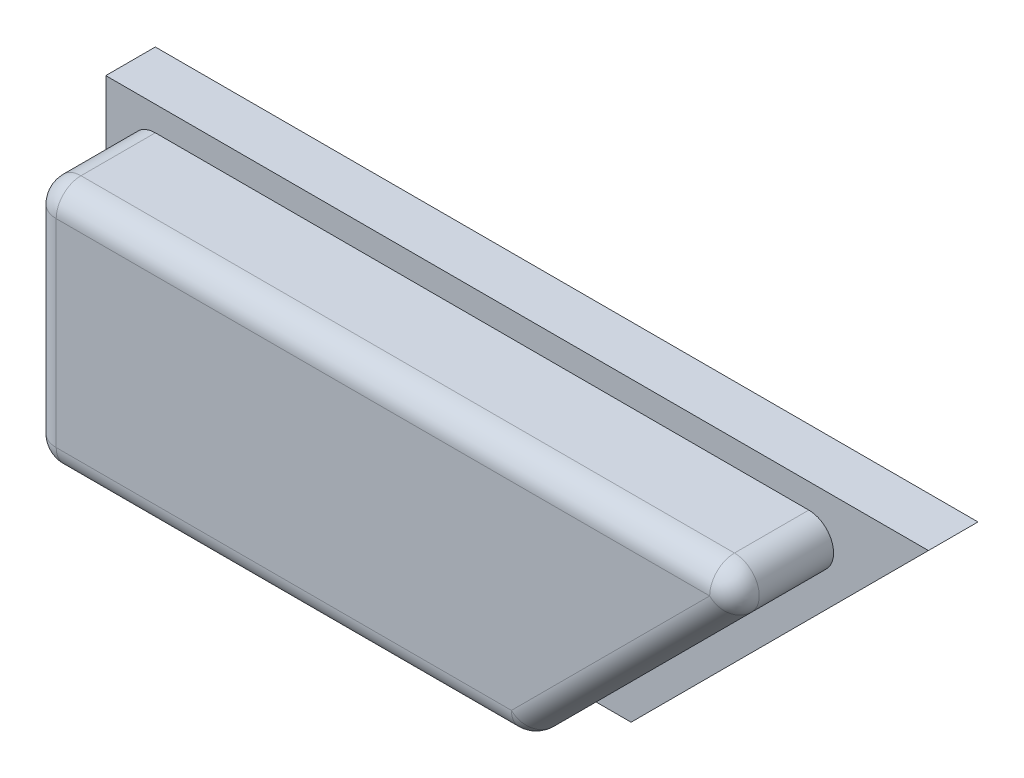
ISO-10303-21;
HEADER;
FILE_DESCRIPTION(('STEP AP214'),'2;1');
FILE_NAME('part.step','',(''),(''),'','','');
FILE_SCHEMA(('AUTOMOTIVE_DESIGN { 1 0 10303 214 1 1 1 1 }'));
ENDSEC;
DATA;
#1=APPLICATION_CONTEXT('core data for automotive mechanical design processes');
#2=APPLICATION_PROTOCOL_DEFINITION('international standard','automotive_design',2000,#1);
#3=PRODUCT_CONTEXT('',#1,'mechanical');
#4=PRODUCT('Part','Part','',(#3));
#5=PRODUCT_RELATED_PRODUCT_CATEGORY('part','',(#4));
#6=PRODUCT_DEFINITION_FORMATION('','',#4);
#7=PRODUCT_DEFINITION_CONTEXT('part definition',#1,'design');
#8=PRODUCT_DEFINITION('design','',#6,#7);
#9=PRODUCT_DEFINITION_SHAPE('','',#8);
#10=(LENGTH_UNIT() NAMED_UNIT(*) SI_UNIT(.MILLI.,.METRE.));
#11=(NAMED_UNIT(*) PLANE_ANGLE_UNIT() SI_UNIT($,.RADIAN.));
#12=(NAMED_UNIT(*) SI_UNIT($,.STERADIAN.) SOLID_ANGLE_UNIT());
#13=UNCERTAINTY_MEASURE_WITH_UNIT(LENGTH_MEASURE(1.E-05),#10,'distance_accuracy_value','');
#14=(GEOMETRIC_REPRESENTATION_CONTEXT(3) GLOBAL_UNCERTAINTY_ASSIGNED_CONTEXT((#13)) GLOBAL_UNIT_ASSIGNED_CONTEXT((#10,
#11,#12)) REPRESENTATION_CONTEXT('',''));
#15=CARTESIAN_POINT('',(0.,0.,0.));
#16=DIRECTION('',(0.,0.,1.));
#17=DIRECTION('',(1.,0.,0.));
#18=AXIS2_PLACEMENT_3D('',#15,#16,#17);
#19=CARTESIAN_POINT('',(0.,0.,1.));
#20=DIRECTION('',(0.,0.,1.));
#21=DIRECTION('',(1.,0.,0.));
#22=AXIS2_PLACEMENT_3D('',#19,#20,#21);
#23=PLANE('',#22);
#24=DIRECTION('',(0.,-1.,0.));
#25=VECTOR('',#24,1.);
#26=CARTESIAN_POINT('',(-10.4142135623731,6.99999999999999,1.));
#27=LINE('',#26,#25);
#28=CARTESIAN_POINT('',(-10.4142135623731,6.99999999999999,1.));
#29=VERTEX_POINT('',#28);
#30=CARTESIAN_POINT('',(-10.4142135623731,0.999999999999999,1.));
#31=VERTEX_POINT('',#30);
#32=EDGE_CURVE('E149',#29,#31,#27,.T.);
#33=ORIENTED_EDGE('',*,*,#32,.T.);
#34=DIRECTION('',(1.,0.,0.));
#35=VECTOR('',#34,1.);
#36=CARTESIAN_POINT('',(-10.4142135623731,0.999999999999999,1.));
#37=LINE('',#36,#35);
#38=CARTESIAN_POINT('',(0.185786437626904,0.999999999999998,1.));
#39=VERTEX_POINT('',#38);
#40=EDGE_CURVE('E138',#31,#39,#37,.T.);
#41=ORIENTED_EDGE('',*,*,#40,.T.);
#42=DIRECTION('',(0.707106781186547,0.707106781186548,0.));
#43=VECTOR('',#42,1.);
#44=CARTESIAN_POINT('',(6.18578643762689,6.99999999999999,1.));
#45=LINE('',#44,#43);
#46=CARTESIAN_POINT('',(6.18578643762689,6.99999999999999,1.));
#47=VERTEX_POINT('',#46);
#48=EDGE_CURVE('E148',#39,#47,#45,.T.);
#49=ORIENTED_EDGE('',*,*,#48,.T.);
#50=DIRECTION('',(-1.,0.,0.));
#51=VECTOR('',#50,1.);
#52=CARTESIAN_POINT('',(0.185786437626905,6.99999999999999,1.));
#53=LINE('',#52,#51);
#54=EDGE_CURVE('E154',#47,#29,#53,.T.);
#55=ORIENTED_EDGE('',*,*,#54,.T.);
#56=EDGE_LOOP('',(#33,#41,#49,#55));
#57=FACE_BOUND('',#56,.T.);
#58=DIRECTION('',(1.,0.,0.));
#59=VECTOR('',#58,1.);
#60=CARTESIAN_POINT('',(-9.91421356237309,1.5,1.));
#61=LINE('',#60,#59);
#62=CARTESIAN_POINT('',(-9.41421356237309,1.5,1.));
#63=VERTEX_POINT('',#62);
#64=CARTESIAN_POINT('',(-0.228427124746192,1.5,1.));
#65=VERTEX_POINT('',#64);
#66=EDGE_CURVE('E243',#63,#65,#61,.T.);
#67=ORIENTED_EDGE('',*,*,#66,.F.);
#68=CARTESIAN_POINT('',(-9.41421356237309,2.,1.));
#69=DIRECTION('',(0.,0.,1.));
#70=DIRECTION('',(1.,0.,0.));
#71=AXIS2_PLACEMENT_3D('',#68,#69,#70);
#72=CIRCLE('',#71,0.5);
#73=CARTESIAN_POINT('',(-9.91421356237309,2.,1.));
#74=VERTEX_POINT('',#73);
#75=EDGE_CURVE('E190',#63,#74,#72,.F.);
#76=ORIENTED_EDGE('',*,*,#75,.T.);
#77=DIRECTION('',(0.,-1.,0.));
#78=VECTOR('',#77,1.);
#79=CARTESIAN_POINT('',(-9.91421356237309,6.5,1.));
#80=LINE('',#79,#78);
#81=CARTESIAN_POINT('',(-9.91421356237309,6.,1.));
#82=VERTEX_POINT('',#81);
#83=EDGE_CURVE('E238',#82,#74,#80,.T.);
#84=ORIENTED_EDGE('',*,*,#83,.F.);
#85=CARTESIAN_POINT('',(-9.41421356237309,6.,1.));
#86=DIRECTION('',(0.,0.,1.));
#87=DIRECTION('',(1.,0.,0.));
#88=AXIS2_PLACEMENT_3D('',#85,#86,#87);
#89=CIRCLE('',#88,0.5);
#90=CARTESIAN_POINT('',(-9.41421356237309,6.5,1.));
#91=VERTEX_POINT('',#90);
#92=EDGE_CURVE('E188',#82,#91,#89,.F.);
#93=ORIENTED_EDGE('',*,*,#92,.T.);
#94=DIRECTION('',(-1.,0.,0.));
#95=VECTOR('',#94,1.);
#96=CARTESIAN_POINT('',(-9.91421356237309,6.5,1.));
#97=LINE('',#96,#95);
#98=CARTESIAN_POINT('',(3.77157287525381,6.5,1.));
#99=VERTEX_POINT('',#98);
#100=EDGE_CURVE('E253',#99,#91,#97,.T.);
#101=ORIENTED_EDGE('',*,*,#100,.F.);
#102=CARTESIAN_POINT('',(3.77157287525381,6.,1.));
#103=DIRECTION('',(0.,0.,1.));
#104=DIRECTION('',(1.,0.,0.));
#105=AXIS2_PLACEMENT_3D('',#102,#103,#104);
#106=CIRCLE('',#105,0.5);
#107=CARTESIAN_POINT('',(4.12512626584708,5.64644660940672,1.));
#108=VERTEX_POINT('',#107);
#109=EDGE_CURVE('E186',#99,#108,#106,.F.);
#110=ORIENTED_EDGE('',*,*,#109,.T.);
#111=DIRECTION('',(0.707106781186548,0.707106781186548,0.));
#112=VECTOR('',#111,1.);
#113=CARTESIAN_POINT('',(4.97867965644035,6.49999999999999,1.));
#114=LINE('',#113,#112);
#115=CARTESIAN_POINT('',(0.125126265847081,1.64644660940672,1.));
#116=VERTEX_POINT('',#115);
#117=EDGE_CURVE('E248',#116,#108,#114,.T.);
#118=ORIENTED_EDGE('',*,*,#117,.F.);
#119=CARTESIAN_POINT('',(-0.228427124746191,2.,1.));
#120=DIRECTION('',(0.,0.,1.));
#121=DIRECTION('',(1.,0.,0.));
#122=AXIS2_PLACEMENT_3D('',#119,#120,#121);
#123=CIRCLE('',#122,0.5);
#124=EDGE_CURVE('E192',#116,#65,#123,.F.);
#125=ORIENTED_EDGE('',*,*,#124,.T.);
#126=EDGE_LOOP('',(#67,#76,#84,#93,#101,#110,#118,#125));
#127=FACE_BOUND('',#126,.T.);
#128=ADVANCED_FACE('F35',(#57,#127),#23,.T.);
#129=CARTESIAN_POINT('',(-10.4142135623731,6.99999999999999,1.));
#130=DIRECTION('',(1.,0.,0.));
#131=DIRECTION('',(0.,1.,0.));
#132=AXIS2_PLACEMENT_3D('',#129,#130,#131);
#133=PLANE('',#132);
#134=DIRECTION('',(0.,-1.,0.));
#135=VECTOR('',#134,1.);
#136=CARTESIAN_POINT('',(-10.4142135623731,6.99999999999999,0.));
#137=LINE('',#136,#135);
#138=CARTESIAN_POINT('',(-10.4142135623731,6.99999999999999,0.));
#139=VERTEX_POINT('',#138);
#140=CARTESIAN_POINT('',(-10.4142135623731,0.999999999999999,0.));
#141=VERTEX_POINT('',#140);
#142=EDGE_CURVE('E162',#139,#141,#137,.T.);
#143=ORIENTED_EDGE('',*,*,#142,.T.);
#144=DIRECTION('',(0.,0.,-1.));
#145=VECTOR('',#144,1.);
#146=CARTESIAN_POINT('',(-10.4142135623731,0.999999999999999,1.));
#147=LINE('',#146,#145);
#148=EDGE_CURVE('E142',#31,#141,#147,.T.);
#149=ORIENTED_EDGE('',*,*,#148,.F.);
#150=ORIENTED_EDGE('',*,*,#32,.F.);
#151=DIRECTION('',(0.,0.,-1.));
#152=VECTOR('',#151,1.);
#153=CARTESIAN_POINT('',(-10.4142135623731,6.99999999999999,1.));
#154=LINE('',#153,#152);
#155=EDGE_CURVE('E258',#29,#139,#154,.T.);
#156=ORIENTED_EDGE('',*,*,#155,.T.);
#157=EDGE_LOOP('',(#143,#149,#150,#156));
#158=FACE_BOUND('',#157,.T.);
#159=ADVANCED_FACE('F160',(#158),#133,.F.);
#160=CARTESIAN_POINT('',(-10.4142135623731,0.999999999999999,1.));
#161=DIRECTION('',(0.,1.,0.));
#162=DIRECTION('',(-1.,0.,0.));
#163=AXIS2_PLACEMENT_3D('',#160,#161,#162);
#164=PLANE('',#163);
#165=DIRECTION('',(1.,0.,0.));
#166=VECTOR('',#165,1.);
#167=CARTESIAN_POINT('',(-10.4142135623731,0.999999999999999,0.));
#168=LINE('',#167,#166);
#169=CARTESIAN_POINT('',(0.185786437626904,0.999999999999998,0.));
#170=VERTEX_POINT('',#169);
#171=EDGE_CURVE('E260',#141,#170,#168,.T.);
#172=ORIENTED_EDGE('',*,*,#171,.T.);
#173=DIRECTION('',(0.,0.,-1.));
#174=VECTOR('',#173,1.);
#175=CARTESIAN_POINT('',(0.185786437626904,0.999999999999998,1.));
#176=LINE('',#175,#174);
#177=EDGE_CURVE('E145',#39,#170,#176,.T.);
#178=ORIENTED_EDGE('',*,*,#177,.F.);
#179=ORIENTED_EDGE('',*,*,#40,.F.);
#180=ORIENTED_EDGE('',*,*,#148,.T.);
#181=EDGE_LOOP('',(#172,#178,#179,#180));
#182=FACE_BOUND('',#181,.T.);
#183=ADVANCED_FACE('F140',(#182),#164,.F.);
#184=CARTESIAN_POINT('',(6.18578643762689,6.99999999999999,1.));
#185=DIRECTION('',(-0.707106781186548,0.707106781186547,0.));
#186=DIRECTION('',(-0.707106781186547,-0.707106781186548,0.));
#187=AXIS2_PLACEMENT_3D('',#184,#185,#186);
#188=PLANE('',#187);
#189=DIRECTION('',(0.707106781186547,0.707106781186548,0.));
#190=VECTOR('',#189,1.);
#191=CARTESIAN_POINT('',(6.18578643762689,6.99999999999999,0.));
#192=LINE('',#191,#190);
#193=CARTESIAN_POINT('',(6.18578643762689,6.99999999999999,0.));
#194=VERTEX_POINT('',#193);
#195=EDGE_CURVE('E262',#170,#194,#192,.T.);
#196=ORIENTED_EDGE('',*,*,#195,.T.);
#197=DIRECTION('',(0.,0.,-1.));
#198=VECTOR('',#197,1.);
#199=CARTESIAN_POINT('',(6.18578643762689,6.99999999999999,1.));
#200=LINE('',#199,#198);
#201=EDGE_CURVE('E167',#47,#194,#200,.T.);
#202=ORIENTED_EDGE('',*,*,#201,.F.);
#203=ORIENTED_EDGE('',*,*,#48,.F.);
#204=ORIENTED_EDGE('',*,*,#177,.T.);
#205=EDGE_LOOP('',(#196,#202,#203,#204));
#206=FACE_BOUND('',#205,.T.);
#207=ADVANCED_FACE('F271',(#206),#188,.F.);
#208=CARTESIAN_POINT('',(-10.4142135623731,6.99999999999999,1.));
#209=DIRECTION('',(0.,-1.,0.));
#210=DIRECTION('',(0.,0.,-1.));
#211=AXIS2_PLACEMENT_3D('',#208,#209,#210);
#212=PLANE('',#211);
#213=DIRECTION('',(-1.,0.,0.));
#214=VECTOR('',#213,1.);
#215=CARTESIAN_POINT('',(-10.4142135623731,6.99999999999999,0.));
#216=LINE('',#215,#214);
#217=EDGE_CURVE('E158',#194,#139,#216,.T.);
#218=ORIENTED_EDGE('',*,*,#217,.T.);
#219=ORIENTED_EDGE('',*,*,#155,.F.);
#220=ORIENTED_EDGE('',*,*,#54,.F.);
#221=ORIENTED_EDGE('',*,*,#201,.T.);
#222=EDGE_LOOP('',(#218,#219,#220,#221));
#223=FACE_BOUND('',#222,.T.);
#224=ADVANCED_FACE('F269',(#223),#212,.F.);
#225=CARTESIAN_POINT('',(0.,0.,0.));
#226=DIRECTION('',(0.,0.,1.));
#227=DIRECTION('',(1.,0.,0.));
#228=AXIS2_PLACEMENT_3D('',#225,#226,#227);
#229=PLANE('',#228);
#230=ORIENTED_EDGE('',*,*,#142,.F.);
#231=ORIENTED_EDGE('',*,*,#217,.F.);
#232=ORIENTED_EDGE('',*,*,#195,.F.);
#233=ORIENTED_EDGE('',*,*,#171,.F.);
#234=EDGE_LOOP('',(#230,#231,#232,#233));
#235=FACE_BOUND('',#234,.T.);
#236=ADVANCED_FACE('F274',(#235),#229,.F.);
#237=CARTESIAN_POINT('',(-9.91421356237309,6.5,3.));
#238=DIRECTION('',(1.,0.,0.));
#239=DIRECTION('',(0.,0.,-1.));
#240=AXIS2_PLACEMENT_3D('',#237,#238,#239);
#241=PLANE('',#240);
#242=DIRECTION('',(0.,0.,-1.));
#243=VECTOR('',#242,1.);
#244=CARTESIAN_POINT('',(-9.91421356237309,2.,3.));
#245=LINE('',#244,#243);
#246=CARTESIAN_POINT('',(-9.91421356237309,2.,2.5));
#247=VERTEX_POINT('',#246);
#248=EDGE_CURVE('E177',#74,#247,#245,.F.);
#249=ORIENTED_EDGE('',*,*,#248,.T.);
#250=DIRECTION('',(0.,-1.,0.));
#251=VECTOR('',#250,1.);
#252=CARTESIAN_POINT('',(-9.91421356237309,6.,2.5));
#253=LINE('',#252,#251);
#254=CARTESIAN_POINT('',(-9.91421356237309,6.,2.5));
#255=VERTEX_POINT('',#254);
#256=EDGE_CURVE('E44',#247,#255,#253,.F.);
#257=ORIENTED_EDGE('',*,*,#256,.T.);
#258=DIRECTION('',(0.,0.,-1.));
#259=VECTOR('',#258,1.);
#260=CARTESIAN_POINT('',(-9.91421356237309,6.,3.));
#261=LINE('',#260,#259);
#262=EDGE_CURVE('E179',#255,#82,#261,.T.);
#263=ORIENTED_EDGE('',*,*,#262,.T.);
#264=ORIENTED_EDGE('',*,*,#83,.T.);
#265=EDGE_LOOP('',(#249,#257,#263,#264));
#266=FACE_BOUND('',#265,.T.);
#267=ADVANCED_FACE('F276',(#266),#241,.F.);
#268=CARTESIAN_POINT('',(-9.91421356237309,1.5,3.));
#269=DIRECTION('',(0.,1.,0.));
#270=DIRECTION('',(0.,0.,1.));
#271=AXIS2_PLACEMENT_3D('',#268,#269,#270);
#272=PLANE('',#271);
#273=DIRECTION('',(0.,0.,-1.));
#274=VECTOR('',#273,1.);
#275=CARTESIAN_POINT('',(-0.228427124746192,1.5,3.));
#276=LINE('',#275,#274);
#277=CARTESIAN_POINT('',(-0.228427124746192,1.5,2.5));
#278=VERTEX_POINT('',#277);
#279=EDGE_CURVE('E181',#65,#278,#276,.F.);
#280=ORIENTED_EDGE('',*,*,#279,.T.);
#281=DIRECTION('',(1.,0.,0.));
#282=VECTOR('',#281,1.);
#283=CARTESIAN_POINT('',(-9.41421356237309,1.5,2.5));
#284=LINE('',#283,#282);
#285=CARTESIAN_POINT('',(-9.41421356237309,1.5,2.5));
#286=VERTEX_POINT('',#285);
#287=EDGE_CURVE('E210',#278,#286,#284,.F.);
#288=ORIENTED_EDGE('',*,*,#287,.T.);
#289=DIRECTION('',(0.,0.,-1.));
#290=VECTOR('',#289,1.);
#291=CARTESIAN_POINT('',(-9.41421356237309,1.5,3.));
#292=LINE('',#291,#290);
#293=EDGE_CURVE('E184',#286,#63,#292,.T.);
#294=ORIENTED_EDGE('',*,*,#293,.T.);
#295=ORIENTED_EDGE('',*,*,#66,.T.);
#296=EDGE_LOOP('',(#280,#288,#294,#295));
#297=FACE_BOUND('',#296,.T.);
#298=ADVANCED_FACE('F283',(#297),#272,.F.);
#299=CARTESIAN_POINT('',(4.97867965644035,6.49999999999999,3.));
#300=DIRECTION('',(-0.707106781186547,0.707106781186548,0.));
#301=DIRECTION('',(-0.707106781186548,-0.707106781186547,0.));
#302=AXIS2_PLACEMENT_3D('',#299,#300,#301);
#303=PLANE('',#302);
#304=DIRECTION('',(0.,0.,-1.));
#305=VECTOR('',#304,1.);
#306=CARTESIAN_POINT('',(4.12512626584708,5.64644660940672,3.));
#307=LINE('',#306,#305);
#308=CARTESIAN_POINT('',(4.12512626584708,5.64644660940672,2.5));
#309=VERTEX_POINT('',#308);
#310=EDGE_CURVE('E174',#108,#309,#307,.F.);
#311=ORIENTED_EDGE('',*,*,#310,.T.);
#312=DIRECTION('',(0.707106781186548,0.707106781186547,0.));
#313=VECTOR('',#312,1.);
#314=CARTESIAN_POINT('',(0.125126265847081,1.64644660940672,2.5));
#315=LINE('',#314,#313);
#316=CARTESIAN_POINT('',(0.125126265847082,1.64644660940672,2.5));
#317=VERTEX_POINT('',#316);
#318=EDGE_CURVE('E206',#309,#317,#315,.F.);
#319=ORIENTED_EDGE('',*,*,#318,.T.);
#320=DIRECTION('',(0.,0.,-1.));
#321=VECTOR('',#320,1.);
#322=CARTESIAN_POINT('',(0.125126265847082,1.64644660940672,3.));
#323=LINE('',#322,#321);
#324=EDGE_CURVE('E172',#317,#116,#323,.T.);
#325=ORIENTED_EDGE('',*,*,#324,.T.);
#326=ORIENTED_EDGE('',*,*,#117,.T.);
#327=EDGE_LOOP('',(#311,#319,#325,#326));
#328=FACE_BOUND('',#327,.T.);
#329=ADVANCED_FACE('F295',(#328),#303,.F.);
#330=CARTESIAN_POINT('',(-9.91421356237309,6.5,3.));
#331=DIRECTION('',(0.,-1.,0.));
#332=DIRECTION('',(0.,0.,-1.));
#333=AXIS2_PLACEMENT_3D('',#330,#331,#332);
#334=PLANE('',#333);
#335=DIRECTION('',(0.,0.,-1.));
#336=VECTOR('',#335,1.);
#337=CARTESIAN_POINT('',(-9.41421356237309,6.5,3.));
#338=LINE('',#337,#336);
#339=CARTESIAN_POINT('',(-9.41421356237309,6.5,2.5));
#340=VERTEX_POINT('',#339);
#341=EDGE_CURVE('E163',#91,#340,#338,.F.);
#342=ORIENTED_EDGE('',*,*,#341,.T.);
#343=DIRECTION('',(-1.,0.,0.));
#344=VECTOR('',#343,1.);
#345=CARTESIAN_POINT('',(3.77157287525381,6.5,2.5));
#346=LINE('',#345,#344);
#347=CARTESIAN_POINT('',(3.77157287525381,6.5,2.5));
#348=VERTEX_POINT('',#347);
#349=EDGE_CURVE('E11',#340,#348,#346,.F.);
#350=ORIENTED_EDGE('',*,*,#349,.T.);
#351=DIRECTION('',(0.,0.,-1.));
#352=VECTOR('',#351,1.);
#353=CARTESIAN_POINT('',(3.77157287525381,6.5,3.));
#354=LINE('',#353,#352);
#355=EDGE_CURVE('E165',#348,#99,#354,.T.);
#356=ORIENTED_EDGE('',*,*,#355,.T.);
#357=ORIENTED_EDGE('',*,*,#100,.T.);
#358=EDGE_LOOP('',(#342,#350,#356,#357));
#359=FACE_BOUND('',#358,.T.);
#360=ADVANCED_FACE('F299',(#359),#334,.F.);
#361=CARTESIAN_POINT('',(0.,0.,3.));
#362=DIRECTION('',(0.,0.,1.));
#363=DIRECTION('',(1.,0.,0.));
#364=AXIS2_PLACEMENT_3D('',#361,#362,#363);
#365=PLANE('',#364);
#366=DIRECTION('',(1.,0.,0.));
#367=VECTOR('',#366,1.);
#368=CARTESIAN_POINT('',(-0.228427124746192,2.,3.));
#369=LINE('',#368,#367);
#370=CARTESIAN_POINT('',(-9.41421356237309,2.,3.));
#371=VERTEX_POINT('',#370);
#372=CARTESIAN_POINT('',(-0.228427124746191,2.,3.));
#373=VERTEX_POINT('',#372);
#374=EDGE_CURVE('E201',#371,#373,#369,.T.);
#375=ORIENTED_EDGE('',*,*,#374,.T.);
#376=DIRECTION('',(0.707106781186548,0.707106781186547,0.));
#377=VECTOR('',#376,1.);
#378=CARTESIAN_POINT('',(3.77157287525381,6.,3.));
#379=LINE('',#378,#377);
#380=CARTESIAN_POINT('',(3.77157287525381,6.,3.));
#381=VERTEX_POINT('',#380);
#382=EDGE_CURVE('E203',#373,#381,#379,.T.);
#383=ORIENTED_EDGE('',*,*,#382,.T.);
#384=DIRECTION('',(-1.,0.,0.));
#385=VECTOR('',#384,1.);
#386=CARTESIAN_POINT('',(-9.41421356237309,6.,3.));
#387=LINE('',#386,#385);
#388=CARTESIAN_POINT('',(-9.41421356237309,6.,3.));
#389=VERTEX_POINT('',#388);
#390=EDGE_CURVE('E197',#381,#389,#387,.T.);
#391=ORIENTED_EDGE('',*,*,#390,.T.);
#392=DIRECTION('',(0.,-1.,0.));
#393=VECTOR('',#392,1.);
#394=CARTESIAN_POINT('',(-9.41421356237309,2.,3.));
#395=LINE('',#394,#393);
#396=EDGE_CURVE('E199',#389,#371,#395,.T.);
#397=ORIENTED_EDGE('',*,*,#396,.T.);
#398=EDGE_LOOP('',(#375,#383,#391,#397));
#399=FACE_BOUND('',#398,.T.);
#400=ADVANCED_FACE('F303',(#399),#365,.T.);
#401=CARTESIAN_POINT('',(3.77157287525381,6.,3.));
#402=DIRECTION('',(0.,0.,-1.));
#403=DIRECTION('',(-1.,0.,0.));
#404=AXIS2_PLACEMENT_3D('',#401,#402,#403);
#405=CYLINDRICAL_SURFACE('',#404,0.5);
#406=ORIENTED_EDGE('',*,*,#355,.F.);
#407=CARTESIAN_POINT('',(3.77157287525381,6.,2.5));
#408=DIRECTION('',(0.,0.,-1.));
#409=DIRECTION('',(-1.,0.,0.));
#410=AXIS2_PLACEMENT_3D('',#407,#408,#409);
#411=CIRCLE('',#410,0.5);
#412=EDGE_CURVE('E194',#348,#309,#411,.T.);
#413=ORIENTED_EDGE('',*,*,#412,.T.);
#414=ORIENTED_EDGE('',*,*,#310,.F.);
#415=ORIENTED_EDGE('',*,*,#109,.F.);
#416=EDGE_LOOP('',(#406,#413,#414,#415));
#417=FACE_BOUND('',#416,.T.);
#418=ADVANCED_FACE('F306',(#417),#405,.T.);
#419=CARTESIAN_POINT('',(-9.41421356237309,6.,3.));
#420=DIRECTION('',(0.,0.,-1.));
#421=DIRECTION('',(-1.,0.,0.));
#422=AXIS2_PLACEMENT_3D('',#419,#420,#421);
#423=CYLINDRICAL_SURFACE('',#422,0.5);
#424=ORIENTED_EDGE('',*,*,#262,.F.);
#425=CARTESIAN_POINT('',(-9.41421356237309,6.,2.5));
#426=DIRECTION('',(0.,0.,-1.));
#427=DIRECTION('',(-1.,0.,0.));
#428=AXIS2_PLACEMENT_3D('',#425,#426,#427);
#429=CIRCLE('',#428,0.5);
#430=EDGE_CURVE('E58',#255,#340,#429,.T.);
#431=ORIENTED_EDGE('',*,*,#430,.T.);
#432=ORIENTED_EDGE('',*,*,#341,.F.);
#433=ORIENTED_EDGE('',*,*,#92,.F.);
#434=EDGE_LOOP('',(#424,#431,#432,#433));
#435=FACE_BOUND('',#434,.T.);
#436=ADVANCED_FACE('F311',(#435),#423,.T.);
#437=CARTESIAN_POINT('',(-9.41421356237309,2.,3.));
#438=DIRECTION('',(0.,0.,-1.));
#439=DIRECTION('',(-1.,0.,0.));
#440=AXIS2_PLACEMENT_3D('',#437,#438,#439);
#441=CYLINDRICAL_SURFACE('',#440,0.5);
#442=ORIENTED_EDGE('',*,*,#293,.F.);
#443=CARTESIAN_POINT('',(-9.41421356237309,2.,2.5));
#444=DIRECTION('',(0.,0.,-1.));
#445=DIRECTION('',(-1.,0.,0.));
#446=AXIS2_PLACEMENT_3D('',#443,#444,#445);
#447=CIRCLE('',#446,0.5);
#448=EDGE_CURVE('E212',#286,#247,#447,.T.);
#449=ORIENTED_EDGE('',*,*,#448,.T.);
#450=ORIENTED_EDGE('',*,*,#248,.F.);
#451=ORIENTED_EDGE('',*,*,#75,.F.);
#452=EDGE_LOOP('',(#442,#449,#450,#451));
#453=FACE_BOUND('',#452,.T.);
#454=ADVANCED_FACE('F368',(#453),#441,.T.);
#455=CARTESIAN_POINT('',(-0.228427124746191,2.,3.));
#456=DIRECTION('',(0.,0.,-1.));
#457=DIRECTION('',(-1.,0.,0.));
#458=AXIS2_PLACEMENT_3D('',#455,#456,#457);
#459=CYLINDRICAL_SURFACE('',#458,0.5);
#460=ORIENTED_EDGE('',*,*,#324,.F.);
#461=CARTESIAN_POINT('',(-0.228427124746191,2.,2.5));
#462=DIRECTION('',(0.,0.,-1.));
#463=DIRECTION('',(-1.,0.,0.));
#464=AXIS2_PLACEMENT_3D('',#461,#462,#463);
#465=CIRCLE('',#464,0.5);
#466=EDGE_CURVE('E208',#317,#278,#465,.T.);
#467=ORIENTED_EDGE('',*,*,#466,.T.);
#468=ORIENTED_EDGE('',*,*,#279,.F.);
#469=ORIENTED_EDGE('',*,*,#124,.F.);
#470=EDGE_LOOP('',(#460,#467,#468,#469));
#471=FACE_BOUND('',#470,.T.);
#472=ADVANCED_FACE('F349',(#471),#459,.T.);
#473=CARTESIAN_POINT('',(-9.41421356237309,2.,2.5));
#474=DIRECTION('',(0.,0.,1.));
#475=DIRECTION('',(1.,0.,0.));
#476=AXIS2_PLACEMENT_3D('',#473,#474,#475);
#477=SPHERICAL_SURFACE('',#476,0.5);
#478=CARTESIAN_POINT('',(-9.41421356237309,2.,2.5));
#479=DIRECTION('',(0.,1.,0.));
#480=DIRECTION('',(-1.,0.,0.));
#481=AXIS2_PLACEMENT_3D('',#478,#479,#480);
#482=CIRCLE('',#481,0.5);
#483=EDGE_CURVE('E231',#247,#371,#482,.T.);
#484=ORIENTED_EDGE('',*,*,#483,.F.);
#485=ORIENTED_EDGE('',*,*,#448,.F.);
#486=CARTESIAN_POINT('',(-9.41421356237309,2.,2.5));
#487=DIRECTION('',(1.,0.,0.));
#488=DIRECTION('',(0.,0.,-1.));
#489=AXIS2_PLACEMENT_3D('',#486,#487,#488);
#490=CIRCLE('',#489,0.5);
#491=EDGE_CURVE('E39',#371,#286,#490,.T.);
#492=ORIENTED_EDGE('',*,*,#491,.F.);
#493=EDGE_LOOP('',(#484,#485,#492));
#494=FACE_BOUND('',#493,.T.);
#495=ADVANCED_FACE('F37',(#494),#477,.T.);
#496=CARTESIAN_POINT('',(0.,2.,2.5));
#497=DIRECTION('',(-1.,0.,0.));
#498=DIRECTION('',(0.,0.,1.));
#499=AXIS2_PLACEMENT_3D('',#496,#497,#498);
#500=CYLINDRICAL_SURFACE('',#499,0.5);
#501=ORIENTED_EDGE('',*,*,#491,.T.);
#502=ORIENTED_EDGE('',*,*,#287,.F.);
#503=CARTESIAN_POINT('',(-0.228427124746191,2.,2.5));
#504=DIRECTION('',(1.,0.,0.));
#505=DIRECTION('',(0.,1.,0.));
#506=AXIS2_PLACEMENT_3D('',#503,#504,#505);
#507=CIRCLE('',#506,0.5);
#508=EDGE_CURVE('E229',#373,#278,#507,.T.);
#509=ORIENTED_EDGE('',*,*,#508,.F.);
#510=ORIENTED_EDGE('',*,*,#374,.F.);
#511=EDGE_LOOP('',(#501,#502,#509,#510));
#512=FACE_BOUND('',#511,.T.);
#513=ADVANCED_FACE('F317',(#512),#500,.T.);
#514=CARTESIAN_POINT('',(-9.41421356237309,0.,2.5));
#515=DIRECTION('',(0.,1.,0.));
#516=DIRECTION('',(0.,0.,1.));
#517=AXIS2_PLACEMENT_3D('',#514,#515,#516);
#518=CYLINDRICAL_SURFACE('',#517,0.5);
#519=ORIENTED_EDGE('',*,*,#483,.T.);
#520=ORIENTED_EDGE('',*,*,#396,.F.);
#521=CARTESIAN_POINT('',(-9.41421356237309,6.,2.5));
#522=DIRECTION('',(0.,1.,0.));
#523=DIRECTION('',(0.,0.,1.));
#524=AXIS2_PLACEMENT_3D('',#521,#522,#523);
#525=CIRCLE('',#524,0.5);
#526=EDGE_CURVE('E226',#255,#389,#525,.T.);
#527=ORIENTED_EDGE('',*,*,#526,.F.);
#528=ORIENTED_EDGE('',*,*,#256,.F.);
#529=EDGE_LOOP('',(#519,#520,#527,#528));
#530=FACE_BOUND('',#529,.T.);
#531=ADVANCED_FACE('F334',(#530),#518,.T.);
#532=CARTESIAN_POINT('',(-0.228427124746191,2.,2.5));
#533=DIRECTION('',(0.,0.,1.));
#534=DIRECTION('',(1.,0.,0.));
#535=AXIS2_PLACEMENT_3D('',#532,#533,#534);
#536=SPHERICAL_SURFACE('',#535,0.5);
#537=ORIENTED_EDGE('',*,*,#508,.T.);
#538=ORIENTED_EDGE('',*,*,#466,.F.);
#539=CARTESIAN_POINT('',(-0.228427124746191,2.,2.5));
#540=DIRECTION('',(0.707106781186548,0.707106781186547,0.));
#541=DIRECTION('',(-0.707106781186547,0.707106781186548,0.));
#542=AXIS2_PLACEMENT_3D('',#539,#540,#541);
#543=CIRCLE('',#542,0.5);
#544=EDGE_CURVE('E223',#373,#317,#543,.T.);
#545=ORIENTED_EDGE('',*,*,#544,.F.);
#546=EDGE_LOOP('',(#537,#538,#545));
#547=FACE_BOUND('',#546,.T.);
#548=ADVANCED_FACE('F320',(#547),#536,.T.);
#549=CARTESIAN_POINT('',(-9.41421356237309,6.,2.5));
#550=DIRECTION('',(0.,0.,1.));
#551=DIRECTION('',(1.,0.,0.));
#552=AXIS2_PLACEMENT_3D('',#549,#550,#551);
#553=SPHERICAL_SURFACE('',#552,0.5);
#554=ORIENTED_EDGE('',*,*,#430,.F.);
#555=ORIENTED_EDGE('',*,*,#526,.T.);
#556=CARTESIAN_POINT('',(-9.41421356237309,6.,2.5));
#557=DIRECTION('',(1.,0.,0.));
#558=DIRECTION('',(0.,0.,-1.));
#559=AXIS2_PLACEMENT_3D('',#556,#557,#558);
#560=CIRCLE('',#559,0.5);
#561=EDGE_CURVE('E220',#340,#389,#560,.T.);
#562=ORIENTED_EDGE('',*,*,#561,.F.);
#563=EDGE_LOOP('',(#554,#555,#562));
#564=FACE_BOUND('',#563,.T.);
#565=ADVANCED_FACE('F336',(#564),#553,.T.);
#566=CARTESIAN_POINT('',(-1.11421356237309,1.1142135623731,2.5));
#567=DIRECTION('',(-0.707106781186548,-0.707106781186547,0.));
#568=DIRECTION('',(0.707106781186547,-0.707106781186548,0.));
#569=AXIS2_PLACEMENT_3D('',#566,#567,#568);
#570=CYLINDRICAL_SURFACE('',#569,0.5);
#571=ORIENTED_EDGE('',*,*,#544,.T.);
#572=ORIENTED_EDGE('',*,*,#318,.F.);
#573=CARTESIAN_POINT('',(3.77157287525381,6.,2.5));
#574=DIRECTION('',(0.707106781186547,0.707106781186547,0.));
#575=DIRECTION('',(-0.707106781186548,0.707106781186548,0.));
#576=AXIS2_PLACEMENT_3D('',#573,#574,#575);
#577=CIRCLE('',#576,0.5);
#578=EDGE_CURVE('E218',#381,#309,#577,.T.);
#579=ORIENTED_EDGE('',*,*,#578,.F.);
#580=ORIENTED_EDGE('',*,*,#382,.F.);
#581=EDGE_LOOP('',(#571,#572,#579,#580));
#582=FACE_BOUND('',#581,.T.);
#583=ADVANCED_FACE('F324',(#582),#570,.T.);
#584=CARTESIAN_POINT('',(0.,6.,2.5));
#585=DIRECTION('',(1.,0.,0.));
#586=DIRECTION('',(0.,0.,-1.));
#587=AXIS2_PLACEMENT_3D('',#584,#585,#586);
#588=CYLINDRICAL_SURFACE('',#587,0.5);
#589=ORIENTED_EDGE('',*,*,#561,.T.);
#590=ORIENTED_EDGE('',*,*,#390,.F.);
#591=CARTESIAN_POINT('',(3.77157287525381,6.,2.5));
#592=DIRECTION('',(1.,0.,0.));
#593=DIRECTION('',(0.,0.,-1.));
#594=AXIS2_PLACEMENT_3D('',#591,#592,#593);
#595=CIRCLE('',#594,0.5);
#596=EDGE_CURVE('E216',#348,#381,#595,.T.);
#597=ORIENTED_EDGE('',*,*,#596,.F.);
#598=ORIENTED_EDGE('',*,*,#349,.F.);
#599=EDGE_LOOP('',(#589,#590,#597,#598));
#600=FACE_BOUND('',#599,.T.);
#601=ADVANCED_FACE('F330',(#600),#588,.T.);
#602=CARTESIAN_POINT('',(3.77157287525381,6.,2.5));
#603=DIRECTION('',(0.,0.,1.));
#604=DIRECTION('',(1.,0.,0.));
#605=AXIS2_PLACEMENT_3D('',#602,#603,#604);
#606=SPHERICAL_SURFACE('',#605,0.5);
#607=ORIENTED_EDGE('',*,*,#578,.T.);
#608=ORIENTED_EDGE('',*,*,#412,.F.);
#609=ORIENTED_EDGE('',*,*,#596,.T.);
#610=EDGE_LOOP('',(#607,#608,#609));
#611=FACE_BOUND('',#610,.T.);
#612=ADVANCED_FACE('F341',(#611),#606,.T.);
#613=CLOSED_SHELL('',(#128,#159,#183,#207,#224,#236,#267,#298,#329,#360,#400,#418,#436,#454,
#472,#495,#513,#531,#548,#565,#583,#601,#612));
#614=MANIFOLD_SOLID_BREP('B2',#613);
#615=ADVANCED_BREP_SHAPE_REPRESENTATION('',(#18,#614),#14);
#616=SHAPE_DEFINITION_REPRESENTATION(#9,#615);
ENDSEC;
END-ISO-10303-21;
